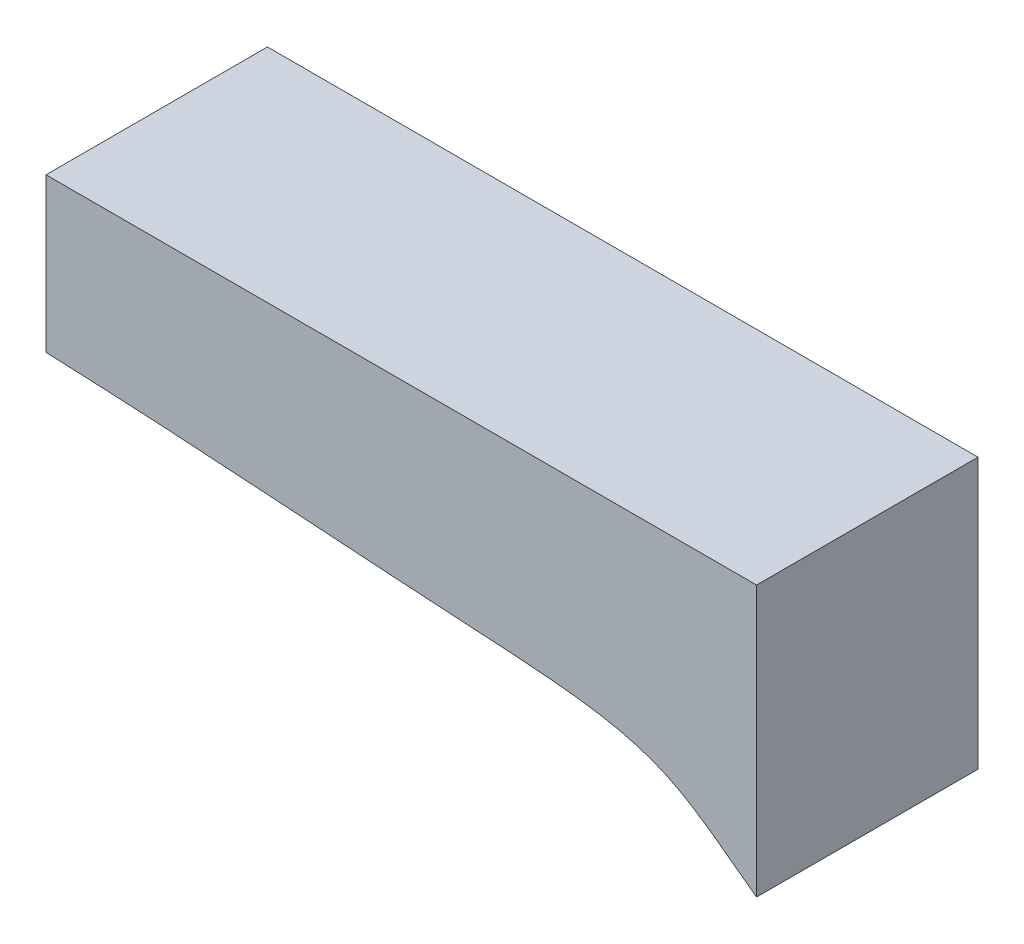
ISO-10303-21;
HEADER;
FILE_DESCRIPTION(('STEP AP214'),'2;1');
FILE_NAME('part.step','',(''),(''),'','','');
FILE_SCHEMA(('AUTOMOTIVE_DESIGN { 1 0 10303 214 1 1 1 1 }'));
ENDSEC;
DATA;
#1=APPLICATION_CONTEXT('core data for automotive mechanical design processes');
#2=APPLICATION_PROTOCOL_DEFINITION('international standard','automotive_design',2000,#1);
#3=PRODUCT_CONTEXT('',#1,'mechanical');
#4=PRODUCT('Part','Part','',(#3));
#5=PRODUCT_RELATED_PRODUCT_CATEGORY('part','',(#4));
#6=PRODUCT_DEFINITION_FORMATION('','',#4);
#7=PRODUCT_DEFINITION_CONTEXT('part definition',#1,'design');
#8=PRODUCT_DEFINITION('design','',#6,#7);
#9=PRODUCT_DEFINITION_SHAPE('','',#8);
#10=(LENGTH_UNIT() NAMED_UNIT(*) SI_UNIT(.MILLI.,.METRE.));
#11=(NAMED_UNIT(*) PLANE_ANGLE_UNIT() SI_UNIT($,.RADIAN.));
#12=(NAMED_UNIT(*) SI_UNIT($,.STERADIAN.) SOLID_ANGLE_UNIT());
#13=UNCERTAINTY_MEASURE_WITH_UNIT(LENGTH_MEASURE(1.E-05),#10,'distance_accuracy_value','');
#14=(GEOMETRIC_REPRESENTATION_CONTEXT(3) GLOBAL_UNCERTAINTY_ASSIGNED_CONTEXT((#13)) GLOBAL_UNIT_ASSIGNED_CONTEXT((#10,
#11,#12)) REPRESENTATION_CONTEXT('',''));
#15=CARTESIAN_POINT('',(0.,0.,0.));
#16=DIRECTION('',(0.,0.,1.));
#17=DIRECTION('',(1.,0.,0.));
#18=AXIS2_PLACEMENT_3D('',#15,#16,#17);
#19=CARTESIAN_POINT('',(-89.8464354599371,-3.29903468842063,43.9999999999997));
#20=CARTESIAN_POINT('',(-88.7443124312654,-3.34417484054242,43.9999999999997));
#21=CARTESIAN_POINT('',(-87.6424485038737,-3.39537445409937,43.9999999999997));
#22=CARTESIAN_POINT('',(-85.4396476783052,-3.51334160220014,43.9999999999997));
#23=CARTESIAN_POINT('',(-84.3387078621186,-3.58065577094571,43.9999999999997));
#24=CARTESIAN_POINT('',(-81.0365639508372,-3.7948164031967,43.9999999999997));
#25=CARTESIAN_POINT('',(-78.8359635414677,-3.95096655204366,43.9999999999997));
#26=CARTESIAN_POINT('',(-75.5329466708115,-4.15222470173706,43.9999999999997));
#27=CARTESIAN_POINT('',(-74.4313362216558,-4.21286421374571,43.9999999999997));
#28=CARTESIAN_POINT('',(-72.7805927476674,-4.31911621371875,43.9999999999997));
#29=CARTESIAN_POINT('',(-72.2306549575597,-4.35723016289085,43.9999999999997));
#30=CARTESIAN_POINT('',(-71.1331128346477,-4.45375398580923,43.9999999999997));
#31=CARTESIAN_POINT('',(-70.5854841547761,-4.51195209384524,43.9999999999997));
#32=CARTESIAN_POINT('',(-69.4962515515806,-4.68075038484792,43.9999999999997));
#33=CARTESIAN_POINT('',(-68.954639790581,-4.79128239734827,43.9999999999997));
#34=CARTESIAN_POINT('',(-68.151432795717,-5.03719269803732,43.9999999999997));
#35=CARTESIAN_POINT('',(-67.886410678466,-5.13264118757321,43.9999999999997));
#36=CARTESIAN_POINT('',(-67.3759586574293,-5.34996845090835,43.9999999999997));
#37=CARTESIAN_POINT('',(-67.1291187510148,-5.47288951904804,43.9999999999997));
#38=CARTESIAN_POINT('',(-66.4097292891263,-5.87757683055509,43.9999999999997));
#39=CARTESIAN_POINT('',(-65.9562243935712,-6.19172140187593,43.9999999999997));
#40=CARTESIAN_POINT('',(-65.0642612150682,-6.84559168693003,43.9999999999997));
#41=CARTESIAN_POINT('',(-64.6273516496033,-7.1875929932571,43.9999999999997));
#42=CARTESIAN_POINT('',(-64.1761851417015,-7.50656454803733,43.9999999999997));
#43=B_SPLINE_CURVE_WITH_KNOTS('',3,(#19,#20,#21,#22,#23,#24,#25,#26,#27,#28,#29,#30,#31,#32,#33,
#34,#35,#36,#37,#38,#39,#40,#41,#42),.UNSPECIFIED.,.F.,.F.,(4,2,2,2,2,2,2,2,2,2,2,4),(0.,
0.125000000000001,0.250000000000002,0.500000000000002,0.625000000000002,0.687500000000001,0.75,
0.812499999999999,0.843749999999999,0.874999999999999,0.937499999999999,1.),.UNSPECIFIED.);
#44=DIRECTION('',(0.,0.,1.));
#45=VECTOR('',#44,1.);
#46=SURFACE_OF_LINEAR_EXTRUSION('',#43,#45);
#47=CARTESIAN_POINT('',(-64.1761851417015,-7.50656454803733,51.9999999999997));
#48=CARTESIAN_POINT('',(-64.6273516496033,-7.1875929932571,51.9999999999997));
#49=CARTESIAN_POINT('',(-65.0642612150682,-6.84559168693003,51.9999999999997));
#50=CARTESIAN_POINT('',(-65.9562243935712,-6.19172140187593,51.9999999999997));
#51=CARTESIAN_POINT('',(-66.4097292891263,-5.87757683055509,51.9999999999997));
#52=CARTESIAN_POINT('',(-67.1291187510148,-5.47288951904804,51.9999999999997));
#53=CARTESIAN_POINT('',(-67.3759586574293,-5.34996845090835,51.9999999999997));
#54=CARTESIAN_POINT('',(-67.886410678466,-5.13264118757321,51.9999999999997));
#55=CARTESIAN_POINT('',(-68.151432795717,-5.03719269803732,51.9999999999997));
#56=CARTESIAN_POINT('',(-68.954639790581,-4.79128239734827,51.9999999999997));
#57=CARTESIAN_POINT('',(-69.4962515515806,-4.68075038484792,51.9999999999997));
#58=CARTESIAN_POINT('',(-70.5854841547761,-4.51195209384524,51.9999999999997));
#59=CARTESIAN_POINT('',(-71.1331128346477,-4.45375398580923,51.9999999999997));
#60=CARTESIAN_POINT('',(-72.2306549575597,-4.35723016289085,51.9999999999997));
#61=CARTESIAN_POINT('',(-72.7805927476674,-4.31911621371875,51.9999999999997));
#62=CARTESIAN_POINT('',(-74.4313362216558,-4.21286421374571,51.9999999999997));
#63=CARTESIAN_POINT('',(-75.5329466708115,-4.15222470173706,51.9999999999997));
#64=CARTESIAN_POINT('',(-78.8359635414677,-3.95096655204366,51.9999999999997));
#65=CARTESIAN_POINT('',(-81.0365639508372,-3.7948164031967,51.9999999999997));
#66=CARTESIAN_POINT('',(-84.3387078621186,-3.58065577094571,51.9999999999997));
#67=CARTESIAN_POINT('',(-85.4396476783052,-3.51334160220014,51.9999999999997));
#68=CARTESIAN_POINT('',(-87.6424485038737,-3.39537445409937,51.9999999999997));
#69=CARTESIAN_POINT('',(-88.7443124312654,-3.34417484054242,51.9999999999997));
#70=CARTESIAN_POINT('',(-89.8464354599371,-3.29903468842063,51.9999999999997));
#71=B_SPLINE_CURVE_WITH_KNOTS('',3,(#47,#48,#49,#50,#51,#52,#53,#54,#55,#56,#57,#58,#59,#60,#61,
#62,#63,#64,#65,#66,#67,#68,#69,#70),.UNSPECIFIED.,.F.,.F.,(4,2,2,2,2,2,2,2,2,2,2,4),(0.,
0.0625000000000007,0.125000000000001,0.156250000000001,0.187500000000001,0.25,0.312499999999999,
0.374999999999998,0.499999999999998,0.749999999999998,0.874999999999999,1.),.UNSPECIFIED.);
#72=CARTESIAN_POINT('',(-89.8464354599371,-3.29903468842062,51.9999999999997));
#73=VERTEX_POINT('',#72);
#74=CARTESIAN_POINT('',(-64.1761851417015,-7.50656454803733,51.9999999999997));
#75=VERTEX_POINT('',#74);
#76=EDGE_CURVE('E106',#73,#75,#71,.F.);
#77=ORIENTED_EDGE('',*,*,#76,.F.);
#78=DIRECTION('',(0.,0.,1.));
#79=VECTOR('',#78,1.);
#80=CARTESIAN_POINT('',(-89.8464354599371,-3.29903468842062,43.9999999999997));
#81=LINE('',#80,#79);
#82=CARTESIAN_POINT('',(-89.8464354599371,-3.29903468842062,43.9999999999997));
#83=VERTEX_POINT('',#82);
#84=EDGE_CURVE('E11',#83,#73,#81,.T.);
#85=ORIENTED_EDGE('',*,*,#84,.F.);
#86=CARTESIAN_POINT('',(-89.8464354599371,-3.29903468842063,43.9999999999997));
#87=CARTESIAN_POINT('',(-88.7443124312654,-3.34417484054242,43.9999999999997));
#88=CARTESIAN_POINT('',(-87.6424485038737,-3.39537445409937,43.9999999999997));
#89=CARTESIAN_POINT('',(-85.4396476783052,-3.51334160220014,43.9999999999997));
#90=CARTESIAN_POINT('',(-84.3387078621186,-3.58065577094571,43.9999999999997));
#91=CARTESIAN_POINT('',(-81.0365639508372,-3.7948164031967,43.9999999999997));
#92=CARTESIAN_POINT('',(-78.8359635414677,-3.95096655204366,43.9999999999997));
#93=CARTESIAN_POINT('',(-75.5329466708115,-4.15222470173706,43.9999999999997));
#94=CARTESIAN_POINT('',(-74.4313362216558,-4.21286421374571,43.9999999999997));
#95=CARTESIAN_POINT('',(-72.7805927476674,-4.31911621371875,43.9999999999997));
#96=CARTESIAN_POINT('',(-72.2306549575597,-4.35723016289085,43.9999999999997));
#97=CARTESIAN_POINT('',(-71.1331128346477,-4.45375398580923,43.9999999999997));
#98=CARTESIAN_POINT('',(-70.5854841547761,-4.51195209384524,43.9999999999997));
#99=CARTESIAN_POINT('',(-69.4962515515806,-4.68075038484792,43.9999999999997));
#100=CARTESIAN_POINT('',(-68.954639790581,-4.79128239734827,43.9999999999997));
#101=CARTESIAN_POINT('',(-68.151432795717,-5.03719269803732,43.9999999999997));
#102=CARTESIAN_POINT('',(-67.886410678466,-5.13264118757321,43.9999999999997));
#103=CARTESIAN_POINT('',(-67.3759586574293,-5.34996845090835,43.9999999999997));
#104=CARTESIAN_POINT('',(-67.1291187510148,-5.47288951904804,43.9999999999997));
#105=CARTESIAN_POINT('',(-66.4097292891263,-5.87757683055509,43.9999999999997));
#106=CARTESIAN_POINT('',(-65.9562243935712,-6.19172140187593,43.9999999999997));
#107=CARTESIAN_POINT('',(-65.0642612150682,-6.84559168693003,43.9999999999997));
#108=CARTESIAN_POINT('',(-64.6273516496033,-7.1875929932571,43.9999999999997));
#109=CARTESIAN_POINT('',(-64.1761851417015,-7.50656454803733,43.9999999999997));
#110=B_SPLINE_CURVE_WITH_KNOTS('',3,(#86,#87,#88,#89,#90,#91,#92,#93,#94,#95,#96,#97,#98,#99,
#100,#101,#102,#103,#104,#105,#106,#107,#108,#109),.UNSPECIFIED.,.F.,.F.,(4,2,2,2,2,2,2,2,2,2,2,
4),(0.,0.125000000000001,0.250000000000002,0.500000000000002,0.625000000000002,
0.687500000000001,0.75,0.812499999999999,0.843749999999999,0.874999999999999,0.937499999999999,
1.),.UNSPECIFIED.);
#111=CARTESIAN_POINT('',(-64.1761851417015,-7.50656454803733,43.9999999999997));
#112=VERTEX_POINT('',#111);
#113=EDGE_CURVE('E93',#83,#112,#110,.T.);
#114=ORIENTED_EDGE('',*,*,#113,.T.);
#115=DIRECTION('',(0.,0.,1.));
#116=VECTOR('',#115,1.);
#117=CARTESIAN_POINT('',(-64.1761851417015,-7.50656454803733,43.9999999999997));
#118=LINE('',#117,#116);
#119=EDGE_CURVE('E75',#112,#75,#118,.T.);
#120=ORIENTED_EDGE('',*,*,#119,.T.);
#121=EDGE_LOOP('',(#77,#85,#114,#120));
#122=FACE_BOUND('',#121,.T.);
#123=ADVANCED_FACE('F30',(#122),#46,.T.);
#124=CARTESIAN_POINT('',(1787.6831369655,596.978958683554,43.9999999999997));
#125=CARTESIAN_POINT('',(-89.9066000628265,398.240453192775,43.9999999999997));
#126=CARTESIAN_POINT('',(-89.8492006669579,199.43277431493,43.9999999999997));
#127=CARTESIAN_POINT('',(-89.8464787798614,0.185286100883268,43.9999999999997));
#128=CARTESIAN_POINT('',(-89.8464718021539,-0.254579849346773,43.9999999999997));
#129=CARTESIAN_POINT('',(-89.8427377544541,-329.722703410957,43.9999999999997));
#130=CARTESIAN_POINT('',(-91.2044526871916,-658.750987144361,43.9999999999997));
#131=CARTESIAN_POINT('',(1558.5201636087,-987.748500310421,43.9999999999997));
#132=B_SPLINE_CURVE_WITH_KNOTS('',3,(#124,#125,#126,#127,#128,#129,#130,#131),.UNSPECIFIED.,.F.,
.F.,(4,2,2,4),(-187.742300800668,-74.0032910204648,-73.7516411237227,114.487359883414),.UNSPECIFIED.);
#133=DIRECTION('',(0.,0.,1.));
#134=VECTOR('',#133,1.);
#135=SURFACE_OF_LINEAR_EXTRUSION('',#132,#134);
#136=CARTESIAN_POINT('',(-89.8464354599371,-3.2990346884206,51.9999999999997));
#137=CARTESIAN_POINT('',(-89.8464566443878,-2.43083839234315,51.9999999999997));
#138=CARTESIAN_POINT('',(-89.8464569771482,-1.56264209588179,51.9999999999997));
#139=CARTESIAN_POINT('',(-89.8464718021539,-0.254579849346773,51.9999999999997));
#140=CARTESIAN_POINT('',(-89.8464787798614,0.185286100883268,51.9999999999997));
#141=CARTESIAN_POINT('',(-89.8464922151943,1.16877889091665,51.9999999999997));
#142=CARTESIAN_POINT('',(-89.8465000504675,1.71240573115159,51.9999999999997));
#143=CARTESIAN_POINT('',(-89.8464699035482,2.25603257039438,51.9999999999997));
#144=B_SPLINE_CURVE_WITH_KNOTS('',3,(#136,#137,#138,#139,#140,#141,#142,#143),.UNSPECIFIED.,.F.,
.F.,(4,2,2,4),(-74.3143031323046,-73.8176029258354,-73.5659530290933,-73.2549409172535),.UNSPECIFIED.);
#145=CARTESIAN_POINT('',(-89.8464697740573,2.25600000000001,51.9999999999997));
#146=VERTEX_POINT('',#145);
#147=EDGE_CURVE('E95',#146,#73,#144,.F.);
#148=ORIENTED_EDGE('',*,*,#147,.F.);
#149=DIRECTION('',(0.,0.,1.));
#150=VECTOR('',#149,1.);
#151=CARTESIAN_POINT('',(-89.8464697740573,2.25600000000001,43.9999999999997));
#152=LINE('',#151,#150);
#153=CARTESIAN_POINT('',(-89.8464697740573,2.25600000000001,43.9999999999997));
#154=VERTEX_POINT('',#153);
#155=EDGE_CURVE('E41',#154,#146,#152,.T.);
#156=ORIENTED_EDGE('',*,*,#155,.F.);
#157=CARTESIAN_POINT('',(-89.8464699053543,2.25600000000731,43.9999999999997));
#158=CARTESIAN_POINT('',(-89.8465000501545,1.71238401756017,43.9999999999997));
#159=CARTESIAN_POINT('',(-89.846492215046,1.16876803412094,43.9999999999997));
#160=CARTESIAN_POINT('',(-89.8464787798614,0.185286100883268,43.9999999999997));
#161=CARTESIAN_POINT('',(-89.8464718021539,-0.254579849346773,43.9999999999997));
#162=CARTESIAN_POINT('',(-89.8464569771482,-1.56264209588179,43.9999999999997));
#163=CARTESIAN_POINT('',(-89.8464566443878,-2.43083839234315,43.9999999999997));
#164=CARTESIAN_POINT('',(-89.8464354599371,-3.2990346884206,43.9999999999997));
#165=B_SPLINE_CURVE_WITH_KNOTS('',3,(#157,#158,#159,#160,#161,#162,#163,#164),.UNSPECIFIED.,.F.,
.F.,(4,2,2,4),(-74.3142969210679,-74.0032910204648,-73.7516411237227,-73.2549409172535),.UNSPECIFIED.);
#166=EDGE_CURVE('E89',#154,#83,#165,.T.);
#167=ORIENTED_EDGE('',*,*,#166,.T.);
#168=ORIENTED_EDGE('',*,*,#84,.T.);
#169=EDGE_LOOP('',(#148,#156,#167,#168));
#170=FACE_BOUND('',#169,.T.);
#171=ADVANCED_FACE('F123',(#170),#135,.T.);
#172=CARTESIAN_POINT('',(-64.1762712286204,2.25600000000001,43.9999999999997));
#173=DIRECTION('',(0.,1.,0.));
#174=DIRECTION('',(0.,0.,1.));
#175=AXIS2_PLACEMENT_3D('',#172,#173,#174);
#176=PLANE('',#175);
#177=DIRECTION('',(-1.,0.,0.));
#178=VECTOR('',#177,1.);
#179=CARTESIAN_POINT('',(-64.1762712286204,2.25600000000001,51.9999999999997));
#180=LINE('',#179,#178);
#181=CARTESIAN_POINT('',(-64.1762712286204,2.25600000000001,51.9999999999997));
#182=VERTEX_POINT('',#181);
#183=EDGE_CURVE('E83',#182,#146,#180,.T.);
#184=ORIENTED_EDGE('',*,*,#183,.F.);
#185=DIRECTION('',(0.,0.,1.));
#186=VECTOR('',#185,1.);
#187=CARTESIAN_POINT('',(-64.1762712286204,2.25600000000001,43.9999999999997));
#188=LINE('',#187,#186);
#189=CARTESIAN_POINT('',(-64.1762712286204,2.25600000000001,43.9999999999997));
#190=VERTEX_POINT('',#189);
#191=EDGE_CURVE('E78',#190,#182,#188,.T.);
#192=ORIENTED_EDGE('',*,*,#191,.F.);
#193=DIRECTION('',(-1.,0.,0.));
#194=VECTOR('',#193,1.);
#195=CARTESIAN_POINT('',(-64.1762712286204,2.25600000000001,43.9999999999997));
#196=LINE('',#195,#194);
#197=EDGE_CURVE('E81',#190,#154,#196,.T.);
#198=ORIENTED_EDGE('',*,*,#197,.T.);
#199=ORIENTED_EDGE('',*,*,#155,.T.);
#200=EDGE_LOOP('',(#184,#192,#198,#199));
#201=FACE_BOUND('',#200,.T.);
#202=ADVANCED_FACE('F80',(#201),#176,.T.);
#203=CARTESIAN_POINT('',(-64.1761851417015,-7.50656454803733,43.9999999999997));
#204=DIRECTION('',(0.999999999961121,8.81806398904474E-06,0.));
#205=DIRECTION('',(-8.81806398904474E-06,0.999999999961121,0.));
#206=AXIS2_PLACEMENT_3D('',#203,#204,#205);
#207=PLANE('',#206);
#208=DIRECTION('',(-8.81806398904474E-06,0.999999999961121,0.));
#209=VECTOR('',#208,1.);
#210=CARTESIAN_POINT('',(-64.1761851417015,-7.50656454803733,51.9999999999997));
#211=LINE('',#210,#209);
#212=EDGE_CURVE('E149',#75,#182,#211,.T.);
#213=ORIENTED_EDGE('',*,*,#212,.F.);
#214=ORIENTED_EDGE('',*,*,#119,.F.);
#215=DIRECTION('',(-8.81806398904474E-06,0.999999999961121,0.));
#216=VECTOR('',#215,1.);
#217=CARTESIAN_POINT('',(-64.1761851417015,-7.50656454803733,43.9999999999997));
#218=LINE('',#217,#216);
#219=EDGE_CURVE('E88',#112,#190,#218,.T.);
#220=ORIENTED_EDGE('',*,*,#219,.T.);
#221=ORIENTED_EDGE('',*,*,#191,.T.);
#222=EDGE_LOOP('',(#213,#214,#220,#221));
#223=FACE_BOUND('',#222,.T.);
#224=ADVANCED_FACE('F92',(#223),#207,.T.);
#225=CARTESIAN_POINT('',(-76.6339522943636,-4.08513865183926,43.9999999999997));
#226=DIRECTION('',(0.,0.,1.));
#227=DIRECTION('',(1.,0.,0.));
#228=AXIS2_PLACEMENT_3D('',#225,#226,#227);
#229=PLANE('',#228);
#230=ORIENTED_EDGE('',*,*,#113,.F.);
#231=ORIENTED_EDGE('',*,*,#166,.F.);
#232=ORIENTED_EDGE('',*,*,#197,.F.);
#233=ORIENTED_EDGE('',*,*,#219,.F.);
#234=EDGE_LOOP('',(#230,#231,#232,#233));
#235=FACE_BOUND('',#234,.T.);
#236=ADVANCED_FACE('F87',(#235),#229,.F.);
#237=CARTESIAN_POINT('',(-76.6339522943636,-4.08513865183926,51.9999999999997));
#238=DIRECTION('',(0.,0.,1.));
#239=DIRECTION('',(1.,0.,0.));
#240=AXIS2_PLACEMENT_3D('',#237,#238,#239);
#241=PLANE('',#240);
#242=ORIENTED_EDGE('',*,*,#76,.T.);
#243=ORIENTED_EDGE('',*,*,#212,.T.);
#244=ORIENTED_EDGE('',*,*,#183,.T.);
#245=ORIENTED_EDGE('',*,*,#147,.T.);
#246=EDGE_LOOP('',(#242,#243,#244,#245));
#247=FACE_BOUND('',#246,.T.);
#248=ADVANCED_FACE('F112',(#247),#241,.T.);
#249=CLOSED_SHELL('',(#123,#171,#202,#224,#236,#248));
#250=MANIFOLD_SOLID_BREP('B2',#249);
#251=ADVANCED_BREP_SHAPE_REPRESENTATION('',(#18,#250),#14);
#252=SHAPE_DEFINITION_REPRESENTATION(#9,#251);
ENDSEC;
END-ISO-10303-21;
